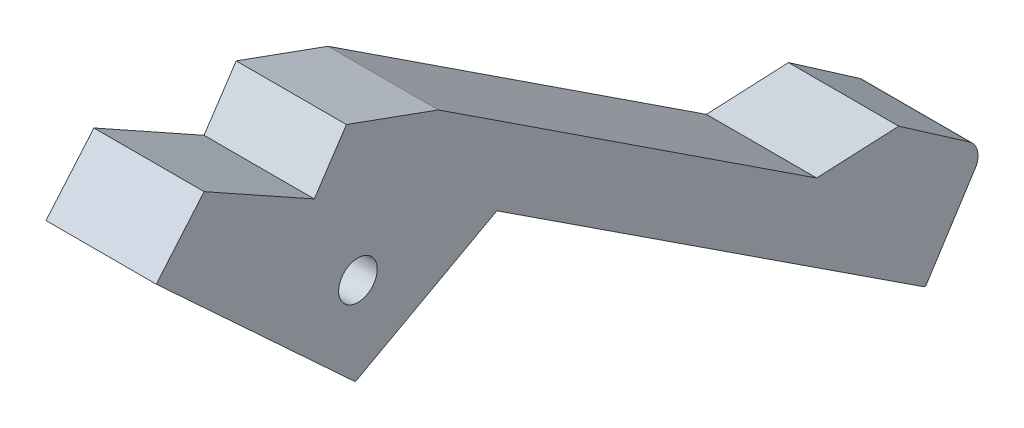
ISO-10303-21;
HEADER;
FILE_DESCRIPTION(('STEP AP214'),'2;1');
FILE_NAME('part.step','',(''),(''),'','','');
FILE_SCHEMA(('AUTOMOTIVE_DESIGN { 1 0 10303 214 1 1 1 1 }'));
ENDSEC;
DATA;
#1=APPLICATION_CONTEXT('core data for automotive mechanical design processes');
#2=APPLICATION_PROTOCOL_DEFINITION('international standard','automotive_design',2000,#1);
#3=PRODUCT_CONTEXT('',#1,'mechanical');
#4=PRODUCT('Part','Part','',(#3));
#5=PRODUCT_RELATED_PRODUCT_CATEGORY('part','',(#4));
#6=PRODUCT_DEFINITION_FORMATION('','',#4);
#7=PRODUCT_DEFINITION_CONTEXT('part definition',#1,'design');
#8=PRODUCT_DEFINITION('design','',#6,#7);
#9=PRODUCT_DEFINITION_SHAPE('','',#8);
#10=(LENGTH_UNIT() NAMED_UNIT(*) SI_UNIT(.MILLI.,.METRE.));
#11=(NAMED_UNIT(*) PLANE_ANGLE_UNIT() SI_UNIT($,.RADIAN.));
#12=(NAMED_UNIT(*) SI_UNIT($,.STERADIAN.) SOLID_ANGLE_UNIT());
#13=UNCERTAINTY_MEASURE_WITH_UNIT(LENGTH_MEASURE(1.E-05),#10,'distance_accuracy_value','');
#14=(GEOMETRIC_REPRESENTATION_CONTEXT(3) GLOBAL_UNCERTAINTY_ASSIGNED_CONTEXT((#13)) GLOBAL_UNIT_ASSIGNED_CONTEXT((#10,
#11,#12)) REPRESENTATION_CONTEXT('',''));
#15=CARTESIAN_POINT('',(0.,0.,0.));
#16=DIRECTION('',(0.,0.,1.));
#17=DIRECTION('',(1.,0.,0.));
#18=AXIS2_PLACEMENT_3D('',#15,#16,#17);
#19=CARTESIAN_POINT('',(6.,-22.011398901803,-65.3574106088778));
#20=DIRECTION('',(-1.,0.,0.));
#21=DIRECTION('',(0.,0.,1.));
#22=AXIS2_PLACEMENT_3D('',#19,#20,#21);
#23=PLANE('',#22);
#24=DIRECTION('',(0.,0.,-1.));
#25=VECTOR('',#24,1.);
#26=CARTESIAN_POINT('',(6.,-31.4451740908881,-61.8059961400669));
#27=LINE('',#26,#25);
#28=CARTESIAN_POINT('',(6.,-31.4451740908881,-61.6328499932323));
#29=VERTEX_POINT('',#28);
#30=CARTESIAN_POINT('',(6.,-31.4451740908881,-61.8059961400669));
#31=VERTEX_POINT('',#30);
#32=EDGE_CURVE('E185',#29,#31,#27,.T.);
#33=ORIENTED_EDGE('',*,*,#32,.T.);
#34=DIRECTION('',(0.,0.841886275784388,-0.539654981118394));
#35=VECTOR('',#34,1.);
#36=CARTESIAN_POINT('',(6.,-22.8463068672385,-67.3179300706856));
#37=LINE('',#36,#35);
#38=CARTESIAN_POINT('',(6.,-22.8463068672385,-67.3179300706856));
#39=VERTEX_POINT('',#38);
#40=EDGE_CURVE('E108',#31,#39,#37,.T.);
#41=ORIENTED_EDGE('',*,*,#40,.T.);
#42=CARTESIAN_POINT('',(6.,-22.011398901803,-65.3574106088778));
#43=DIRECTION('',(1.,0.,0.));
#44=DIRECTION('',(0.,0.,1.));
#45=AXIS2_PLACEMENT_3D('',#42,#43,#44);
#46=CIRCLE('',#45,2.13089367892317);
#47=CARTESIAN_POINT('',(6.,-20.2595596252124,-66.5705746620335));
#48=VERTEX_POINT('',#47);
#49=EDGE_CURVE('E215',#39,#48,#46,.T.);
#50=ORIENTED_EDGE('',*,*,#49,.T.);
#51=DIRECTION('',(0.,0.56932171940588,0.822114821550331));
#52=VECTOR('',#51,1.);
#53=CARTESIAN_POINT('',(6.,-14.9204399968019,-58.8607521997408));
#54=LINE('',#53,#52);
#55=CARTESIAN_POINT('',(6.,-14.9204399968019,-58.8607521997408));
#56=VERTEX_POINT('',#55);
#57=EDGE_CURVE('E234',#48,#56,#54,.T.);
#58=ORIENTED_EDGE('',*,*,#57,.T.);
#59=DIRECTION('',(0.,-0.0463345044702595,0.998925980088362));
#60=VECTOR('',#59,1.);
#61=CARTESIAN_POINT('',(6.,-15.3349108545693,-49.925171415034));
#62=LINE('',#61,#60);
#63=CARTESIAN_POINT('',(6.,-15.3349108545693,-49.925171415034));
#64=VERTEX_POINT('',#63);
#65=EDGE_CURVE('E231',#56,#64,#62,.T.);
#66=ORIENTED_EDGE('',*,*,#65,.T.);
#67=DIRECTION('',(0.,0.54841189293325,0.83620834466619));
#68=VECTOR('',#67,1.);
#69=CARTESIAN_POINT('',(6.,11.6711547572481,-8.74682041243637));
#70=LINE('',#69,#68);
#71=CARTESIAN_POINT('',(6.,11.6711547572481,-8.74682041243637));
#72=VERTEX_POINT('',#71);
#73=EDGE_CURVE('E233',#64,#72,#70,.T.);
#74=ORIENTED_EDGE('',*,*,#73,.T.);
#75=DIRECTION('',(0.,0.340470443415839,0.940255219161384));
#76=VECTOR('',#75,1.);
#77=CARTESIAN_POINT('',(6.,15.2900728142559,1.2473116968904));
#78=LINE('',#77,#76);
#79=CARTESIAN_POINT('',(6.,15.2900728142559,1.2473116968904));
#80=VERTEX_POINT('',#79);
#81=EDGE_CURVE('E236',#72,#80,#78,.T.);
#82=ORIENTED_EDGE('',*,*,#81,.T.);
#83=DIRECTION('',(0.,-0.832666730215395,0.55377442735504));
#84=VECTOR('',#83,1.);
#85=CARTESIAN_POINT('',(6.,15.2900728142559,1.2473116968904));
#86=LINE('',#85,#84);
#87=CARTESIAN_POINT('',(6.,10.0276303692776,4.7471585692434));
#88=VERTEX_POINT('',#87);
#89=EDGE_CURVE('E242',#80,#88,#86,.T.);
#90=ORIENTED_EDGE('',*,*,#89,.T.);
#91=DIRECTION('',(0.,0.48691531325017,0.873449184396258));
#92=VECTOR('',#91,1.);
#93=CARTESIAN_POINT('',(6.,16.7120257222751,16.7379083164343));
#94=LINE('',#93,#92);
#95=CARTESIAN_POINT('',(6.,16.7120257222751,16.7379083164343));
#96=VERTEX_POINT('',#95);
#97=EDGE_CURVE('E244',#88,#96,#94,.T.);
#98=ORIENTED_EDGE('',*,*,#97,.T.);
#99=DIRECTION('',(0.,-0.761498901517041,0.648166200127976));
#100=VECTOR('',#99,1.);
#101=CARTESIAN_POINT('',(6.,10.5905108459399,21.9483676204682));
#102=LINE('',#101,#100);
#103=CARTESIAN_POINT('',(6.,10.5905108459399,21.9483676204682));
#104=VERTEX_POINT('',#103);
#105=EDGE_CURVE('E142',#96,#104,#102,.T.);
#106=ORIENTED_EDGE('',*,*,#105,.T.);
#107=DIRECTION('',(0.,-0.678750059910894,-0.73436935949899));
#108=VECTOR('',#107,1.);
#109=CARTESIAN_POINT('',(6.,-9.43511295209948,0.281769868617523));
#110=LINE('',#109,#108);
#111=CARTESIAN_POINT('',(6.,-9.43511295209948,0.281769868617523));
#112=VERTEX_POINT('',#111);
#113=EDGE_CURVE('E136',#104,#112,#110,.T.);
#114=ORIENTED_EDGE('',*,*,#113,.T.);
#115=DIRECTION('',(0.,0.478944795149479,-0.877845022312722));
#116=VECTOR('',#115,1.);
#117=CARTESIAN_POINT('',(6.,-1.02892327707827,-15.1257089004771));
#118=LINE('',#117,#116);
#119=CARTESIAN_POINT('',(6.,-1.02892327707827,-15.1257089004771));
#120=VERTEX_POINT('',#119);
#121=EDGE_CURVE('E140',#112,#120,#118,.T.);
#122=ORIENTED_EDGE('',*,*,#121,.T.);
#123=DIRECTION('',(0.,-0.547346872563408,-0.836905849600214));
#124=VECTOR('',#123,1.);
#125=CARTESIAN_POINT('',(6.,-31.4451740908881,-61.6328499932323));
#126=LINE('',#125,#124);
#127=EDGE_CURVE('E50',#120,#29,#126,.T.);
#128=ORIENTED_EDGE('',*,*,#127,.T.);
#129=EDGE_LOOP('',(#33,#41,#50,#58,#66,#74,#82,#90,#98,#106,#114,#122,#128));
#130=FACE_BOUND('',#129,.T.);
#131=CARTESIAN_POINT('',(6.,0.,0.));
#132=DIRECTION('',(1.,0.,0.));
#133=DIRECTION('',(0.,0.,-1.));
#134=AXIS2_PLACEMENT_3D('',#131,#132,#133);
#135=CIRCLE('',#134,2.1);
#136=CARTESIAN_POINT('',(6.,0.,-2.1));
#137=VERTEX_POINT('',#136);
#138=EDGE_CURVE('E164',#137,#137,#135,.T.);
#139=ORIENTED_EDGE('',*,*,#138,.F.);
#140=EDGE_LOOP('',(#139));
#141=FACE_BOUND('',#140,.T.);
#142=ADVANCED_FACE('F33',(#130,#141),#23,.F.);
#143=CARTESIAN_POINT('',(-6.,-22.011398901803,-65.3574106088778));
#144=DIRECTION('',(-1.,0.,0.));
#145=DIRECTION('',(0.,0.,1.));
#146=AXIS2_PLACEMENT_3D('',#143,#144,#145);
#147=PLANE('',#146);
#148=DIRECTION('',(0.,0.,-1.));
#149=VECTOR('',#148,1.);
#150=CARTESIAN_POINT('',(-6.,-31.4451740908881,-61.8059961400669));
#151=LINE('',#150,#149);
#152=CARTESIAN_POINT('',(-6.,-31.4451740908881,-61.6328499932323));
#153=VERTEX_POINT('',#152);
#154=CARTESIAN_POINT('',(-6.,-31.4451740908881,-61.8059961400669));
#155=VERTEX_POINT('',#154);
#156=EDGE_CURVE('E160',#153,#155,#151,.T.);
#157=ORIENTED_EDGE('',*,*,#156,.F.);
#158=DIRECTION('',(0.,-0.547346872563408,-0.836905849600214));
#159=VECTOR('',#158,1.);
#160=CARTESIAN_POINT('',(-6.,-31.4451740908881,-61.6328499932323));
#161=LINE('',#160,#159);
#162=CARTESIAN_POINT('',(-6.,-1.02892327707827,-15.1257089004771));
#163=VERTEX_POINT('',#162);
#164=EDGE_CURVE('E100',#163,#153,#161,.T.);
#165=ORIENTED_EDGE('',*,*,#164,.F.);
#166=DIRECTION('',(0.,0.478944795149479,-0.877845022312722));
#167=VECTOR('',#166,1.);
#168=CARTESIAN_POINT('',(-6.,-1.02892327707827,-15.1257089004771));
#169=LINE('',#168,#167);
#170=CARTESIAN_POINT('',(-6.,-9.43511295209948,0.281769868617523));
#171=VERTEX_POINT('',#170);
#172=EDGE_CURVE('E94',#171,#163,#169,.T.);
#173=ORIENTED_EDGE('',*,*,#172,.F.);
#174=DIRECTION('',(0.,-0.678750059910894,-0.73436935949899));
#175=VECTOR('',#174,1.);
#176=CARTESIAN_POINT('',(-6.,-9.43511295209948,0.281769868617523));
#177=LINE('',#176,#175);
#178=CARTESIAN_POINT('',(-6.,10.5905108459399,21.9483676204682));
#179=VERTEX_POINT('',#178);
#180=EDGE_CURVE('E150',#179,#171,#177,.T.);
#181=ORIENTED_EDGE('',*,*,#180,.F.);
#182=DIRECTION('',(0.,-0.761498901517041,0.648166200127976));
#183=VECTOR('',#182,1.);
#184=CARTESIAN_POINT('',(-6.,10.5905108459399,21.9483676204682));
#185=LINE('',#184,#183);
#186=CARTESIAN_POINT('',(-6.,16.7120257222751,16.7379083164343));
#187=VERTEX_POINT('',#186);
#188=EDGE_CURVE('E180',#187,#179,#185,.T.);
#189=ORIENTED_EDGE('',*,*,#188,.F.);
#190=DIRECTION('',(0.,0.48691531325017,0.873449184396258));
#191=VECTOR('',#190,1.);
#192=CARTESIAN_POINT('',(-6.,16.7120257222751,16.7379083164343));
#193=LINE('',#192,#191);
#194=CARTESIAN_POINT('',(-6.,10.0276303692776,4.7471585692434));
#195=VERTEX_POINT('',#194);
#196=EDGE_CURVE('E178',#195,#187,#193,.T.);
#197=ORIENTED_EDGE('',*,*,#196,.F.);
#198=DIRECTION('',(0.,-0.832666730215395,0.55377442735504));
#199=VECTOR('',#198,1.);
#200=CARTESIAN_POINT('',(-6.,15.2900728142559,1.2473116968904));
#201=LINE('',#200,#199);
#202=CARTESIAN_POINT('',(-6.,15.2900728142559,1.2473116968904));
#203=VERTEX_POINT('',#202);
#204=EDGE_CURVE('E176',#203,#195,#201,.T.);
#205=ORIENTED_EDGE('',*,*,#204,.F.);
#206=DIRECTION('',(0.,0.340470443415839,0.940255219161384));
#207=VECTOR('',#206,1.);
#208=CARTESIAN_POINT('',(-6.,15.2900728142559,1.2473116968904));
#209=LINE('',#208,#207);
#210=CARTESIAN_POINT('',(-6.,11.6711547572481,-8.74682041243637));
#211=VERTEX_POINT('',#210);
#212=EDGE_CURVE('E174',#211,#203,#209,.T.);
#213=ORIENTED_EDGE('',*,*,#212,.F.);
#214=DIRECTION('',(0.,0.54841189293325,0.83620834466619));
#215=VECTOR('',#214,1.);
#216=CARTESIAN_POINT('',(-6.,11.6711547572481,-8.74682041243637));
#217=LINE('',#216,#215);
#218=CARTESIAN_POINT('',(-6.,-15.3349108545693,-49.925171415034));
#219=VERTEX_POINT('',#218);
#220=EDGE_CURVE('E172',#219,#211,#217,.T.);
#221=ORIENTED_EDGE('',*,*,#220,.F.);
#222=DIRECTION('',(0.,-0.0463345044702595,0.998925980088362));
#223=VECTOR('',#222,1.);
#224=CARTESIAN_POINT('',(-6.,-15.3349108545693,-49.925171415034));
#225=LINE('',#224,#223);
#226=CARTESIAN_POINT('',(-6.,-14.9204399968019,-58.8607521997408));
#227=VERTEX_POINT('',#226);
#228=EDGE_CURVE('E170',#227,#219,#225,.T.);
#229=ORIENTED_EDGE('',*,*,#228,.F.);
#230=DIRECTION('',(0.,0.56932171940588,0.822114821550331));
#231=VECTOR('',#230,1.);
#232=CARTESIAN_POINT('',(-6.,-14.9204399968019,-58.8607521997408));
#233=LINE('',#232,#231);
#234=CARTESIAN_POINT('',(-6.,-20.2595596252124,-66.5705746620335));
#235=VERTEX_POINT('',#234);
#236=EDGE_CURVE('E168',#235,#227,#233,.T.);
#237=ORIENTED_EDGE('',*,*,#236,.F.);
#238=CARTESIAN_POINT('',(-6.,-22.011398901803,-65.3574106088778));
#239=DIRECTION('',(1.,0.,0.));
#240=DIRECTION('',(0.,0.,1.));
#241=AXIS2_PLACEMENT_3D('',#238,#239,#240);
#242=CIRCLE('',#241,2.13089367892317);
#243=CARTESIAN_POINT('',(-6.,-22.8463068672385,-67.3179300706856));
#244=VERTEX_POINT('',#243);
#245=EDGE_CURVE('E166',#244,#235,#242,.T.);
#246=ORIENTED_EDGE('',*,*,#245,.F.);
#247=DIRECTION('',(0.,0.841886275784388,-0.539654981118394));
#248=VECTOR('',#247,1.);
#249=CARTESIAN_POINT('',(-6.,-22.8463068672385,-67.3179300706856));
#250=LINE('',#249,#248);
#251=EDGE_CURVE('E163',#155,#244,#250,.T.);
#252=ORIENTED_EDGE('',*,*,#251,.F.);
#253=EDGE_LOOP('',(#157,#165,#173,#181,#189,#197,#205,#213,#221,#229,#237,#246,#252));
#254=FACE_BOUND('',#253,.T.);
#255=CARTESIAN_POINT('',(-6.,0.,0.));
#256=DIRECTION('',(1.,0.,0.));
#257=DIRECTION('',(0.,0.,-1.));
#258=AXIS2_PLACEMENT_3D('',#255,#256,#257);
#259=CIRCLE('',#258,2.1);
#260=CARTESIAN_POINT('',(-6.,0.,-2.1));
#261=VERTEX_POINT('',#260);
#262=EDGE_CURVE('E404',#261,#261,#259,.T.);
#263=ORIENTED_EDGE('',*,*,#262,.T.);
#264=EDGE_LOOP('',(#263));
#265=FACE_BOUND('',#264,.T.);
#266=ADVANCED_FACE('F219',(#254,#265),#147,.T.);
#267=CARTESIAN_POINT('',(6.,-31.4451740908881,-61.8059961400669));
#268=DIRECTION('',(0.,1.,0.));
#269=DIRECTION('',(0.,0.,1.));
#270=AXIS2_PLACEMENT_3D('',#267,#268,#269);
#271=PLANE('',#270);
#272=ORIENTED_EDGE('',*,*,#156,.T.);
#273=DIRECTION('',(-1.,0.,0.));
#274=VECTOR('',#273,1.);
#275=CARTESIAN_POINT('',(6.,-31.4451740908881,-61.8059961400669));
#276=LINE('',#275,#274);
#277=EDGE_CURVE('E11',#31,#155,#276,.T.);
#278=ORIENTED_EDGE('',*,*,#277,.F.);
#279=ORIENTED_EDGE('',*,*,#32,.F.);
#280=DIRECTION('',(-1.,0.,0.));
#281=VECTOR('',#280,1.);
#282=CARTESIAN_POINT('',(6.,-31.4451740908881,-61.6328499932323));
#283=LINE('',#282,#281);
#284=EDGE_CURVE('E156',#29,#153,#283,.T.);
#285=ORIENTED_EDGE('',*,*,#284,.T.);
#286=EDGE_LOOP('',(#272,#278,#279,#285));
#287=FACE_BOUND('',#286,.T.);
#288=ADVANCED_FACE('F35',(#287),#271,.F.);
#289=CARTESIAN_POINT('',(6.,-22.8463068672385,-67.3179300706856));
#290=DIRECTION('',(0.,0.539654981118393,0.841886275784388));
#291=DIRECTION('',(0.,-0.841886275784388,0.539654981118394));
#292=AXIS2_PLACEMENT_3D('',#289,#290,#291);
#293=PLANE('',#292);
#294=ORIENTED_EDGE('',*,*,#251,.T.);
#295=DIRECTION('',(-1.,0.,0.));
#296=VECTOR('',#295,1.);
#297=CARTESIAN_POINT('',(6.,-22.8463068672385,-67.3179300706856));
#298=LINE('',#297,#296);
#299=EDGE_CURVE('E42',#39,#244,#298,.T.);
#300=ORIENTED_EDGE('',*,*,#299,.F.);
#301=ORIENTED_EDGE('',*,*,#40,.F.);
#302=ORIENTED_EDGE('',*,*,#277,.T.);
#303=EDGE_LOOP('',(#294,#300,#301,#302));
#304=FACE_BOUND('',#303,.T.);
#305=ADVANCED_FACE('F278',(#304),#293,.F.);
#306=CARTESIAN_POINT('',(6.,-22.011398901803,-65.3574106088778));
#307=DIRECTION('',(-1.,0.,0.));
#308=DIRECTION('',(0.,0.,1.));
#309=AXIS2_PLACEMENT_3D('',#306,#307,#308);
#310=CYLINDRICAL_SURFACE('',#309,2.13089367892317);
#311=ORIENTED_EDGE('',*,*,#245,.T.);
#312=DIRECTION('',(-1.,0.,0.));
#313=VECTOR('',#312,1.);
#314=CARTESIAN_POINT('',(6.,-20.2595596252124,-66.5705746620335));
#315=LINE('',#314,#313);
#316=EDGE_CURVE('E207',#48,#235,#315,.T.);
#317=ORIENTED_EDGE('',*,*,#316,.F.);
#318=ORIENTED_EDGE('',*,*,#49,.F.);
#319=ORIENTED_EDGE('',*,*,#299,.T.);
#320=EDGE_LOOP('',(#311,#317,#318,#319));
#321=FACE_BOUND('',#320,.T.);
#322=ADVANCED_FACE('F213',(#321),#310,.T.);
#323=CARTESIAN_POINT('',(6.,-14.9204399968019,-58.8607521997408));
#324=DIRECTION('',(0.,-0.822114821550331,0.56932171940588));
#325=DIRECTION('',(0.,-0.56932171940588,-0.822114821550331));
#326=AXIS2_PLACEMENT_3D('',#323,#324,#325);
#327=PLANE('',#326);
#328=ORIENTED_EDGE('',*,*,#236,.T.);
#329=DIRECTION('',(-1.,0.,0.));
#330=VECTOR('',#329,1.);
#331=CARTESIAN_POINT('',(6.,-14.9204399968019,-58.8607521997408));
#332=LINE('',#331,#330);
#333=EDGE_CURVE('E204',#56,#227,#332,.T.);
#334=ORIENTED_EDGE('',*,*,#333,.F.);
#335=ORIENTED_EDGE('',*,*,#57,.F.);
#336=ORIENTED_EDGE('',*,*,#316,.T.);
#337=EDGE_LOOP('',(#328,#334,#335,#336));
#338=FACE_BOUND('',#337,.T.);
#339=ADVANCED_FACE('F225',(#338),#327,.F.);
#340=CARTESIAN_POINT('',(6.,-15.3349108545693,-49.925171415034));
#341=DIRECTION('',(0.,-0.998925980088362,-0.0463345044702595));
#342=DIRECTION('',(0.,0.0463345044702595,-0.998925980088362));
#343=AXIS2_PLACEMENT_3D('',#340,#341,#342);
#344=PLANE('',#343);
#345=ORIENTED_EDGE('',*,*,#228,.T.);
#346=DIRECTION('',(-1.,0.,0.));
#347=VECTOR('',#346,1.);
#348=CARTESIAN_POINT('',(6.,-15.3349108545693,-49.925171415034));
#349=LINE('',#348,#347);
#350=EDGE_CURVE('E201',#64,#219,#349,.T.);
#351=ORIENTED_EDGE('',*,*,#350,.F.);
#352=ORIENTED_EDGE('',*,*,#65,.F.);
#353=ORIENTED_EDGE('',*,*,#333,.T.);
#354=EDGE_LOOP('',(#345,#351,#352,#353));
#355=FACE_BOUND('',#354,.T.);
#356=ADVANCED_FACE('F229',(#355),#344,.F.);
#357=CARTESIAN_POINT('',(6.,11.6711547572481,-8.74682041243637));
#358=DIRECTION('',(0.,-0.83620834466619,0.54841189293325));
#359=DIRECTION('',(0.,-0.54841189293325,-0.83620834466619));
#360=AXIS2_PLACEMENT_3D('',#357,#358,#359);
#361=PLANE('',#360);
#362=ORIENTED_EDGE('',*,*,#220,.T.);
#363=DIRECTION('',(-1.,0.,0.));
#364=VECTOR('',#363,1.);
#365=CARTESIAN_POINT('',(6.,11.6711547572481,-8.74682041243637));
#366=LINE('',#365,#364);
#367=EDGE_CURVE('E198',#72,#211,#366,.T.);
#368=ORIENTED_EDGE('',*,*,#367,.F.);
#369=ORIENTED_EDGE('',*,*,#73,.F.);
#370=ORIENTED_EDGE('',*,*,#350,.T.);
#371=EDGE_LOOP('',(#362,#368,#369,#370));
#372=FACE_BOUND('',#371,.T.);
#373=ADVANCED_FACE('F291',(#372),#361,.F.);
#374=CARTESIAN_POINT('',(6.,15.2900728142559,1.2473116968904));
#375=DIRECTION('',(0.,-0.940255219161384,0.340470443415839));
#376=DIRECTION('',(0.,-0.340470443415839,-0.940255219161384));
#377=AXIS2_PLACEMENT_3D('',#374,#375,#376);
#378=PLANE('',#377);
#379=ORIENTED_EDGE('',*,*,#212,.T.);
#380=DIRECTION('',(-1.,0.,0.));
#381=VECTOR('',#380,1.);
#382=CARTESIAN_POINT('',(6.,15.2900728142559,1.2473116968904));
#383=LINE('',#382,#381);
#384=EDGE_CURVE('E195',#80,#203,#383,.T.);
#385=ORIENTED_EDGE('',*,*,#384,.F.);
#386=ORIENTED_EDGE('',*,*,#81,.F.);
#387=ORIENTED_EDGE('',*,*,#367,.T.);
#388=EDGE_LOOP('',(#379,#385,#386,#387));
#389=FACE_BOUND('',#388,.T.);
#390=ADVANCED_FACE('F294',(#389),#378,.F.);
#391=CARTESIAN_POINT('',(6.,15.2900728142559,1.2473116968904));
#392=DIRECTION('',(0.,-0.55377442735504,-0.832666730215395));
#393=DIRECTION('',(0.,0.832666730215395,-0.55377442735504));
#394=AXIS2_PLACEMENT_3D('',#391,#392,#393);
#395=PLANE('',#394);
#396=ORIENTED_EDGE('',*,*,#204,.T.);
#397=DIRECTION('',(-1.,0.,0.));
#398=VECTOR('',#397,1.);
#399=CARTESIAN_POINT('',(6.,10.0276303692776,4.7471585692434));
#400=LINE('',#399,#398);
#401=EDGE_CURVE('E192',#88,#195,#400,.T.);
#402=ORIENTED_EDGE('',*,*,#401,.F.);
#403=ORIENTED_EDGE('',*,*,#89,.F.);
#404=ORIENTED_EDGE('',*,*,#384,.T.);
#405=EDGE_LOOP('',(#396,#402,#403,#404));
#406=FACE_BOUND('',#405,.T.);
#407=ADVANCED_FACE('F298',(#406),#395,.F.);
#408=CARTESIAN_POINT('',(6.,16.7120257222751,16.7379083164343));
#409=DIRECTION('',(0.,-0.873449184396258,0.48691531325017));
#410=DIRECTION('',(0.,-0.48691531325017,-0.873449184396258));
#411=AXIS2_PLACEMENT_3D('',#408,#409,#410);
#412=PLANE('',#411);
#413=ORIENTED_EDGE('',*,*,#196,.T.);
#414=DIRECTION('',(-1.,0.,0.));
#415=VECTOR('',#414,1.);
#416=CARTESIAN_POINT('',(6.,16.7120257222751,16.7379083164343));
#417=LINE('',#416,#415);
#418=EDGE_CURVE('E189',#96,#187,#417,.T.);
#419=ORIENTED_EDGE('',*,*,#418,.F.);
#420=ORIENTED_EDGE('',*,*,#97,.F.);
#421=ORIENTED_EDGE('',*,*,#401,.T.);
#422=EDGE_LOOP('',(#413,#419,#420,#421));
#423=FACE_BOUND('',#422,.T.);
#424=ADVANCED_FACE('F250',(#423),#412,.F.);
#425=CARTESIAN_POINT('',(6.,10.5905108459399,21.9483676204682));
#426=DIRECTION('',(0.,-0.648166200127976,-0.761498901517041));
#427=DIRECTION('',(0.,0.761498901517041,-0.648166200127976));
#428=AXIS2_PLACEMENT_3D('',#425,#426,#427);
#429=PLANE('',#428);
#430=ORIENTED_EDGE('',*,*,#188,.T.);
#431=DIRECTION('',(-1.,0.,0.));
#432=VECTOR('',#431,1.);
#433=CARTESIAN_POINT('',(6.,10.5905108459399,21.9483676204682));
#434=LINE('',#433,#432);
#435=EDGE_CURVE('E151',#104,#179,#434,.T.);
#436=ORIENTED_EDGE('',*,*,#435,.F.);
#437=ORIENTED_EDGE('',*,*,#105,.F.);
#438=ORIENTED_EDGE('',*,*,#418,.T.);
#439=EDGE_LOOP('',(#430,#436,#437,#438));
#440=FACE_BOUND('',#439,.T.);
#441=ADVANCED_FACE('F254',(#440),#429,.F.);
#442=CARTESIAN_POINT('',(6.,-9.43511295209948,0.281769868617523));
#443=DIRECTION('',(0.,0.734369359498991,-0.678750059910894));
#444=DIRECTION('',(0.,0.678750059910894,0.734369359498991));
#445=AXIS2_PLACEMENT_3D('',#442,#443,#444);
#446=PLANE('',#445);
#447=ORIENTED_EDGE('',*,*,#180,.T.);
#448=DIRECTION('',(-1.,0.,0.));
#449=VECTOR('',#448,1.);
#450=CARTESIAN_POINT('',(6.,-9.43511295209948,0.281769868617523));
#451=LINE('',#450,#449);
#452=EDGE_CURVE('E147',#112,#171,#451,.T.);
#453=ORIENTED_EDGE('',*,*,#452,.F.);
#454=ORIENTED_EDGE('',*,*,#113,.F.);
#455=ORIENTED_EDGE('',*,*,#435,.T.);
#456=EDGE_LOOP('',(#447,#453,#454,#455));
#457=FACE_BOUND('',#456,.T.);
#458=ADVANCED_FACE('F148',(#457),#446,.F.);
#459=CARTESIAN_POINT('',(6.,-1.02892327707827,-15.1257089004771));
#460=DIRECTION('',(0.,0.877845022312722,0.478944795149478));
#461=DIRECTION('',(0.,-0.478944795149479,0.877845022312723));
#462=AXIS2_PLACEMENT_3D('',#459,#460,#461);
#463=PLANE('',#462);
#464=ORIENTED_EDGE('',*,*,#172,.T.);
#465=DIRECTION('',(-1.,0.,0.));
#466=VECTOR('',#465,1.);
#467=CARTESIAN_POINT('',(6.,-1.02892327707827,-15.1257089004771));
#468=LINE('',#467,#466);
#469=EDGE_CURVE('E152',#120,#163,#468,.T.);
#470=ORIENTED_EDGE('',*,*,#469,.F.);
#471=ORIENTED_EDGE('',*,*,#121,.F.);
#472=ORIENTED_EDGE('',*,*,#452,.T.);
#473=EDGE_LOOP('',(#464,#470,#471,#472));
#474=FACE_BOUND('',#473,.T.);
#475=ADVANCED_FACE('F154',(#474),#463,.F.);
#476=CARTESIAN_POINT('',(6.,-31.4451740908881,-61.6328499932323));
#477=DIRECTION('',(0.,0.836905849600214,-0.547346872563408));
#478=DIRECTION('',(0.,0.547346872563408,0.836905849600214));
#479=AXIS2_PLACEMENT_3D('',#476,#477,#478);
#480=PLANE('',#479);
#481=ORIENTED_EDGE('',*,*,#164,.T.);
#482=ORIENTED_EDGE('',*,*,#284,.F.);
#483=ORIENTED_EDGE('',*,*,#127,.F.);
#484=ORIENTED_EDGE('',*,*,#469,.T.);
#485=EDGE_LOOP('',(#481,#482,#483,#484));
#486=FACE_BOUND('',#485,.T.);
#487=ADVANCED_FACE('F258',(#486),#480,.F.);
#488=CARTESIAN_POINT('',(6.,0.,0.));
#489=DIRECTION('',(-1.,0.,0.));
#490=DIRECTION('',(0.,0.,1.));
#491=AXIS2_PLACEMENT_3D('',#488,#489,#490);
#492=CYLINDRICAL_SURFACE('',#491,2.1);
#493=ORIENTED_EDGE('',*,*,#138,.T.);
#494=EDGE_LOOP('',(#493));
#495=FACE_BOUND('',#494,.T.);
#496=ORIENTED_EDGE('',*,*,#262,.F.);
#497=EDGE_LOOP('',(#496));
#498=FACE_BOUND('',#497,.T.);
#499=ADVANCED_FACE('F260',(#495,#498),#492,.F.);
#500=CLOSED_SHELL('',(#142,#266,#288,#305,#322,#339,#356,#373,#390,#407,#424,#441,#458,#475,
#487,#499));
#501=MANIFOLD_SOLID_BREP('B2',#500);
#502=ADVANCED_BREP_SHAPE_REPRESENTATION('',(#18,#501),#14);
#503=SHAPE_DEFINITION_REPRESENTATION(#9,#502);
ENDSEC;
END-ISO-10303-21;
